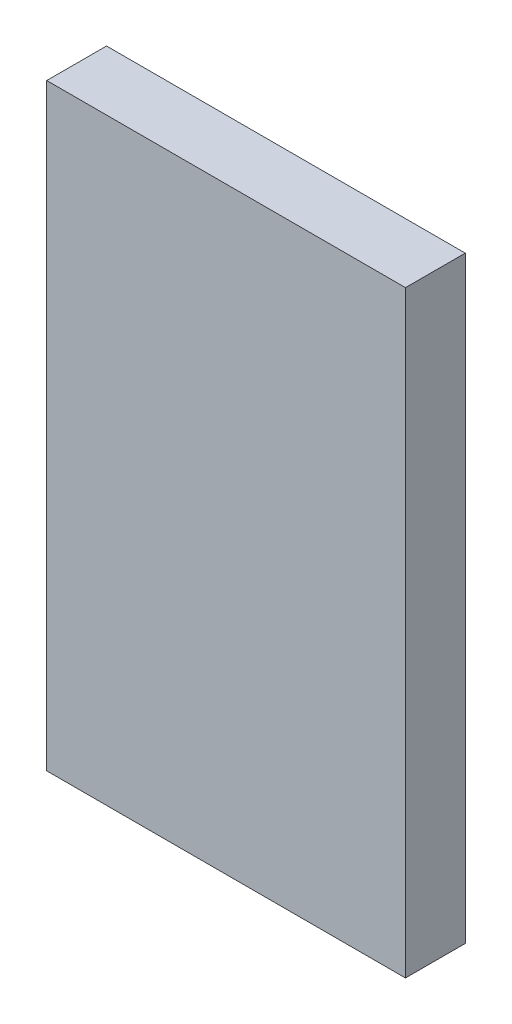
ISO-10303-21;
HEADER;
FILE_DESCRIPTION(('STEP AP214'),'2;1');
FILE_NAME('part.step','',(''),(''),'','','');
FILE_SCHEMA(('AUTOMOTIVE_DESIGN { 1 0 10303 214 1 1 1 1 }'));
ENDSEC;
DATA;
#1=APPLICATION_CONTEXT('core data for automotive mechanical design processes');
#2=APPLICATION_PROTOCOL_DEFINITION('international standard','automotive_design',2000,#1);
#3=PRODUCT_CONTEXT('',#1,'mechanical');
#4=PRODUCT('Part','Part','',(#3));
#5=PRODUCT_RELATED_PRODUCT_CATEGORY('part','',(#4));
#6=PRODUCT_DEFINITION_FORMATION('','',#4);
#7=PRODUCT_DEFINITION_CONTEXT('part definition',#1,'design');
#8=PRODUCT_DEFINITION('design','',#6,#7);
#9=PRODUCT_DEFINITION_SHAPE('','',#8);
#10=(LENGTH_UNIT() NAMED_UNIT(*) SI_UNIT(.MILLI.,.METRE.));
#11=(NAMED_UNIT(*) PLANE_ANGLE_UNIT() SI_UNIT($,.RADIAN.));
#12=(NAMED_UNIT(*) SI_UNIT($,.STERADIAN.) SOLID_ANGLE_UNIT());
#13=UNCERTAINTY_MEASURE_WITH_UNIT(LENGTH_MEASURE(1.E-05),#10,'distance_accuracy_value','');
#14=(GEOMETRIC_REPRESENTATION_CONTEXT(3) GLOBAL_UNCERTAINTY_ASSIGNED_CONTEXT((#13)) GLOBAL_UNIT_ASSIGNED_CONTEXT((#10,
#11,#12)) REPRESENTATION_CONTEXT('',''));
#15=CARTESIAN_POINT('',(0.,0.,0.));
#16=DIRECTION('',(0.,0.,1.));
#17=DIRECTION('',(1.,0.,0.));
#18=AXIS2_PLACEMENT_3D('',#15,#16,#17);
#19=CARTESIAN_POINT('',(0.,0.,15.));
#20=DIRECTION('',(1.,0.,0.));
#21=DIRECTION('',(0.,0.,-1.));
#22=AXIS2_PLACEMENT_3D('',#19,#20,#21);
#23=PLANE('',#22);
#24=DIRECTION('',(0.,-1.,0.));
#25=VECTOR('',#24,1.);
#26=CARTESIAN_POINT('',(0.,0.,0.));
#27=LINE('',#26,#25);
#28=CARTESIAN_POINT('',(0.,0.,0.));
#29=VERTEX_POINT('',#28);
#30=CARTESIAN_POINT('',(0.,-150.,0.));
#31=VERTEX_POINT('',#30);
#32=EDGE_CURVE('E107',#29,#31,#27,.T.);
#33=ORIENTED_EDGE('',*,*,#32,.T.);
#34=DIRECTION('',(0.,0.,-1.));
#35=VECTOR('',#34,1.);
#36=CARTESIAN_POINT('',(0.,-150.,15.));
#37=LINE('',#36,#35);
#38=CARTESIAN_POINT('',(0.,-150.,15.));
#39=VERTEX_POINT('',#38);
#40=EDGE_CURVE('E11',#39,#31,#37,.T.);
#41=ORIENTED_EDGE('',*,*,#40,.F.);
#42=DIRECTION('',(0.,-1.,0.));
#43=VECTOR('',#42,1.);
#44=CARTESIAN_POINT('',(0.,0.,15.));
#45=LINE('',#44,#43);
#46=CARTESIAN_POINT('',(0.,0.,15.));
#47=VERTEX_POINT('',#46);
#48=EDGE_CURVE('E91',#47,#39,#45,.T.);
#49=ORIENTED_EDGE('',*,*,#48,.F.);
#50=DIRECTION('',(0.,0.,-1.));
#51=VECTOR('',#50,1.);
#52=CARTESIAN_POINT('',(0.,0.,15.));
#53=LINE('',#52,#51);
#54=EDGE_CURVE('E103',#47,#29,#53,.T.);
#55=ORIENTED_EDGE('',*,*,#54,.T.);
#56=EDGE_LOOP('',(#33,#41,#49,#55));
#57=FACE_BOUND('',#56,.T.);
#58=ADVANCED_FACE('F39',(#57),#23,.F.);
#59=CARTESIAN_POINT('',(0.,-150.,15.));
#60=DIRECTION('',(0.,1.,0.));
#61=DIRECTION('',(0.,0.,1.));
#62=AXIS2_PLACEMENT_3D('',#59,#60,#61);
#63=PLANE('',#62);
#64=DIRECTION('',(1.,0.,0.));
#65=VECTOR('',#64,1.);
#66=CARTESIAN_POINT('',(0.,-150.,0.));
#67=LINE('',#66,#65);
#68=CARTESIAN_POINT('',(90.,-150.,0.));
#69=VERTEX_POINT('',#68);
#70=EDGE_CURVE('E96',#31,#69,#67,.T.);
#71=ORIENTED_EDGE('',*,*,#70,.T.);
#72=DIRECTION('',(0.,0.,-1.));
#73=VECTOR('',#72,1.);
#74=CARTESIAN_POINT('',(90.,-150.,15.));
#75=LINE('',#74,#73);
#76=CARTESIAN_POINT('',(90.,-150.,15.));
#77=VERTEX_POINT('',#76);
#78=EDGE_CURVE('E48',#77,#69,#75,.T.);
#79=ORIENTED_EDGE('',*,*,#78,.F.);
#80=DIRECTION('',(1.,0.,0.));
#81=VECTOR('',#80,1.);
#82=CARTESIAN_POINT('',(0.,-150.,15.));
#83=LINE('',#82,#81);
#84=EDGE_CURVE('E86',#39,#77,#83,.T.);
#85=ORIENTED_EDGE('',*,*,#84,.F.);
#86=ORIENTED_EDGE('',*,*,#40,.T.);
#87=EDGE_LOOP('',(#71,#79,#85,#86));
#88=FACE_BOUND('',#87,.T.);
#89=ADVANCED_FACE('F95',(#88),#63,.F.);
#90=CARTESIAN_POINT('',(90.,0.,15.));
#91=DIRECTION('',(-1.,0.,0.));
#92=DIRECTION('',(0.,-1.,0.));
#93=AXIS2_PLACEMENT_3D('',#90,#91,#92);
#94=PLANE('',#93);
#95=DIRECTION('',(0.,1.,0.));
#96=VECTOR('',#95,1.);
#97=CARTESIAN_POINT('',(90.,0.,0.));
#98=LINE('',#97,#96);
#99=CARTESIAN_POINT('',(90.,0.,0.));
#100=VERTEX_POINT('',#99);
#101=EDGE_CURVE('E73',#69,#100,#98,.T.);
#102=ORIENTED_EDGE('',*,*,#101,.T.);
#103=DIRECTION('',(0.,0.,-1.));
#104=VECTOR('',#103,1.);
#105=CARTESIAN_POINT('',(90.,0.,15.));
#106=LINE('',#105,#104);
#107=CARTESIAN_POINT('',(90.,0.,15.));
#108=VERTEX_POINT('',#107);
#109=EDGE_CURVE('E98',#108,#100,#106,.T.);
#110=ORIENTED_EDGE('',*,*,#109,.F.);
#111=DIRECTION('',(0.,1.,0.));
#112=VECTOR('',#111,1.);
#113=CARTESIAN_POINT('',(90.,0.,15.));
#114=LINE('',#113,#112);
#115=EDGE_CURVE('E89',#77,#108,#114,.T.);
#116=ORIENTED_EDGE('',*,*,#115,.F.);
#117=ORIENTED_EDGE('',*,*,#78,.T.);
#118=EDGE_LOOP('',(#102,#110,#116,#117));
#119=FACE_BOUND('',#118,.T.);
#120=ADVANCED_FACE('F99',(#119),#94,.F.);
#121=CARTESIAN_POINT('',(0.,0.,15.));
#122=DIRECTION('',(0.,-1.,0.));
#123=DIRECTION('',(0.,0.,-1.));
#124=AXIS2_PLACEMENT_3D('',#121,#122,#123);
#125=PLANE('',#124);
#126=DIRECTION('',(-1.,0.,0.));
#127=VECTOR('',#126,1.);
#128=CARTESIAN_POINT('',(0.,0.,0.));
#129=LINE('',#128,#127);
#130=EDGE_CURVE('E79',#100,#29,#129,.T.);
#131=ORIENTED_EDGE('',*,*,#130,.T.);
#132=ORIENTED_EDGE('',*,*,#54,.F.);
#133=DIRECTION('',(-1.,0.,0.));
#134=VECTOR('',#133,1.);
#135=CARTESIAN_POINT('',(0.,0.,15.));
#136=LINE('',#135,#134);
#137=EDGE_CURVE('E56',#108,#47,#136,.T.);
#138=ORIENTED_EDGE('',*,*,#137,.F.);
#139=ORIENTED_EDGE('',*,*,#109,.T.);
#140=EDGE_LOOP('',(#131,#132,#138,#139));
#141=FACE_BOUND('',#140,.T.);
#142=ADVANCED_FACE('F120',(#141),#125,.F.);
#143=CARTESIAN_POINT('',(0.,0.,15.));
#144=DIRECTION('',(0.,0.,1.));
#145=DIRECTION('',(1.,0.,0.));
#146=AXIS2_PLACEMENT_3D('',#143,#144,#145);
#147=PLANE('',#146);
#148=ORIENTED_EDGE('',*,*,#48,.T.);
#149=ORIENTED_EDGE('',*,*,#84,.T.);
#150=ORIENTED_EDGE('',*,*,#115,.T.);
#151=ORIENTED_EDGE('',*,*,#137,.T.);
#152=EDGE_LOOP('',(#148,#149,#150,#151));
#153=FACE_BOUND('',#152,.T.);
#154=ADVANCED_FACE('F87',(#153),#147,.T.);
#155=CARTESIAN_POINT('',(0.,0.,0.));
#156=DIRECTION('',(0.,0.,1.));
#157=DIRECTION('',(1.,0.,0.));
#158=AXIS2_PLACEMENT_3D('',#155,#156,#157);
#159=PLANE('',#158);
#160=ORIENTED_EDGE('',*,*,#32,.F.);
#161=ORIENTED_EDGE('',*,*,#130,.F.);
#162=ORIENTED_EDGE('',*,*,#101,.F.);
#163=ORIENTED_EDGE('',*,*,#70,.F.);
#164=EDGE_LOOP('',(#160,#161,#162,#163));
#165=FACE_BOUND('',#164,.T.);
#166=ADVANCED_FACE('F123',(#165),#159,.F.);
#167=CLOSED_SHELL('',(#58,#89,#120,#142,#154,#166));
#168=MANIFOLD_SOLID_BREP('B2',#167);
#169=ADVANCED_BREP_SHAPE_REPRESENTATION('',(#18,#168),#14);
#170=SHAPE_DEFINITION_REPRESENTATION(#9,#169);
ENDSEC;
END-ISO-10303-21;
